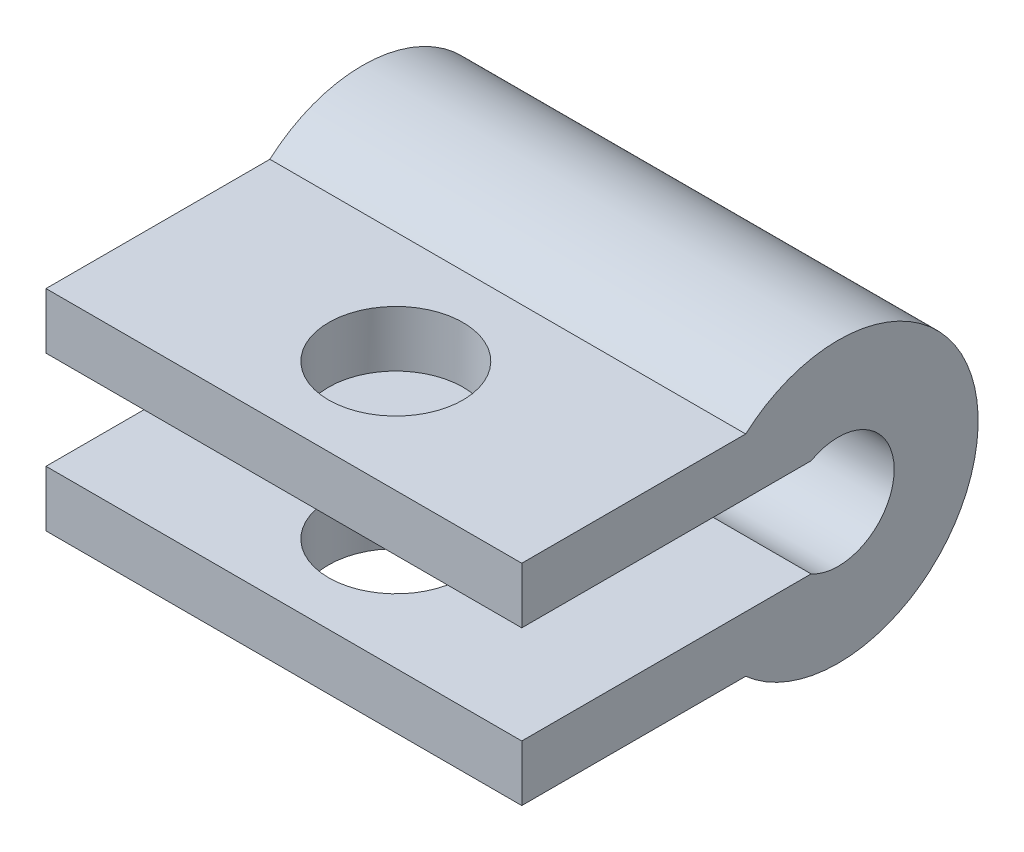
ISO-10303-21;
HEADER;
FILE_DESCRIPTION(('STEP AP214'),'2;1');
FILE_NAME('part.step','',(''),(''),'','','');
FILE_SCHEMA(('AUTOMOTIVE_DESIGN { 1 0 10303 214 1 1 1 1 }'));
ENDSEC;
DATA;
#1=APPLICATION_CONTEXT('core data for automotive mechanical design processes');
#2=APPLICATION_PROTOCOL_DEFINITION('international standard','automotive_design',2000,#1);
#3=PRODUCT_CONTEXT('',#1,'mechanical');
#4=PRODUCT('Part','Part','',(#3));
#5=PRODUCT_RELATED_PRODUCT_CATEGORY('part','',(#4));
#6=PRODUCT_DEFINITION_FORMATION('','',#4);
#7=PRODUCT_DEFINITION_CONTEXT('part definition',#1,'design');
#8=PRODUCT_DEFINITION('design','',#6,#7);
#9=PRODUCT_DEFINITION_SHAPE('','',#8);
#10=(LENGTH_UNIT() NAMED_UNIT(*) SI_UNIT(.MILLI.,.METRE.));
#11=(NAMED_UNIT(*) PLANE_ANGLE_UNIT() SI_UNIT($,.RADIAN.));
#12=(NAMED_UNIT(*) SI_UNIT($,.STERADIAN.) SOLID_ANGLE_UNIT());
#13=UNCERTAINTY_MEASURE_WITH_UNIT(LENGTH_MEASURE(1.E-05),#10,'distance_accuracy_value','');
#14=(GEOMETRIC_REPRESENTATION_CONTEXT(3) GLOBAL_UNCERTAINTY_ASSIGNED_CONTEXT((#13)) GLOBAL_UNIT_ASSIGNED_CONTEXT((#10,
#11,#12)) REPRESENTATION_CONTEXT('',''));
#15=CARTESIAN_POINT('',(0.,0.,0.));
#16=DIRECTION('',(0.,0.,1.));
#17=DIRECTION('',(1.,0.,0.));
#18=AXIS2_PLACEMENT_3D('',#15,#16,#17);
#19=CARTESIAN_POINT('',(-8.5,0.,0.));
#20=DIRECTION('',(1.,0.,0.));
#21=DIRECTION('',(0.,0.,-1.));
#22=AXIS2_PLACEMENT_3D('',#19,#20,#21);
#23=CYLINDRICAL_SURFACE('',#22,2.);
#24=DIRECTION('',(1.,0.,0.));
#25=VECTOR('',#24,1.);
#26=CARTESIAN_POINT('',(-8.5,-1.75,0.968245836551855));
#27=LINE('',#26,#25);
#28=CARTESIAN_POINT('',(-8.5,-1.75,0.968245836551855));
#29=VERTEX_POINT('',#28);
#30=CARTESIAN_POINT('',(8.5,-1.75,0.968245836551855));
#31=VERTEX_POINT('',#30);
#32=EDGE_CURVE('E97',#29,#31,#27,.T.);
#33=ORIENTED_EDGE('',*,*,#32,.T.);
#34=CARTESIAN_POINT('',(8.5,0.,0.));
#35=DIRECTION('',(-1.,0.,0.));
#36=DIRECTION('',(0.,0.,1.));
#37=AXIS2_PLACEMENT_3D('',#34,#35,#36);
#38=CIRCLE('',#37,2.);
#39=CARTESIAN_POINT('',(8.5,1.75,0.968245836551853));
#40=VERTEX_POINT('',#39);
#41=EDGE_CURVE('E100',#40,#31,#38,.T.);
#42=ORIENTED_EDGE('',*,*,#41,.F.);
#43=DIRECTION('',(1.,0.,0.));
#44=VECTOR('',#43,1.);
#45=CARTESIAN_POINT('',(-8.5,1.75,0.968245836551853));
#46=LINE('',#45,#44);
#47=CARTESIAN_POINT('',(-8.5,1.75,0.968245836551853));
#48=VERTEX_POINT('',#47);
#49=EDGE_CURVE('E11',#48,#40,#46,.T.);
#50=ORIENTED_EDGE('',*,*,#49,.F.);
#51=CARTESIAN_POINT('',(-8.5,0.,0.));
#52=DIRECTION('',(-1.,0.,0.));
#53=DIRECTION('',(0.,0.,1.));
#54=AXIS2_PLACEMENT_3D('',#51,#52,#53);
#55=CIRCLE('',#54,2.);
#56=EDGE_CURVE('E101',#48,#29,#55,.T.);
#57=ORIENTED_EDGE('',*,*,#56,.T.);
#58=EDGE_LOOP('',(#33,#42,#50,#57));
#59=FACE_BOUND('',#58,.T.);
#60=ADVANCED_FACE('F35',(#59),#23,.F.);
#61=CARTESIAN_POINT('',(-8.5,1.75,11.3071891388307));
#62=DIRECTION('',(0.,-1.,0.));
#63=DIRECTION('',(0.,0.,-1.));
#64=AXIS2_PLACEMENT_3D('',#61,#62,#63);
#65=PLANE('',#64);
#66=CARTESIAN_POINT('',(0.,1.75,7.30718913883074));
#67=DIRECTION('',(0.,-1.,0.));
#68=DIRECTION('',(0.,0.,-1.));
#69=AXIS2_PLACEMENT_3D('',#66,#67,#68);
#70=CIRCLE('',#69,2.4);
#71=CARTESIAN_POINT('',(0.,1.75,4.90718913883074));
#72=VERTEX_POINT('',#71);
#73=EDGE_CURVE('E119',#72,#72,#70,.T.);
#74=ORIENTED_EDGE('',*,*,#73,.F.);
#75=EDGE_LOOP('',(#74));
#76=FACE_BOUND('',#75,.T.);
#77=ORIENTED_EDGE('',*,*,#49,.T.);
#78=DIRECTION('',(0.,0.,-1.));
#79=VECTOR('',#78,1.);
#80=CARTESIAN_POINT('',(8.5,1.75,11.3071891388307));
#81=LINE('',#80,#79);
#82=CARTESIAN_POINT('',(8.5,1.75,11.3071891388307));
#83=VERTEX_POINT('',#82);
#84=EDGE_CURVE('E118',#83,#40,#81,.T.);
#85=ORIENTED_EDGE('',*,*,#84,.F.);
#86=DIRECTION('',(1.,0.,0.));
#87=VECTOR('',#86,1.);
#88=CARTESIAN_POINT('',(-8.5,1.75,11.3071891388307));
#89=LINE('',#88,#87);
#90=CARTESIAN_POINT('',(-8.5,1.75,11.3071891388307));
#91=VERTEX_POINT('',#90);
#92=EDGE_CURVE('E43',#91,#83,#89,.T.);
#93=ORIENTED_EDGE('',*,*,#92,.F.);
#94=DIRECTION('',(0.,0.,-1.));
#95=VECTOR('',#94,1.);
#96=CARTESIAN_POINT('',(-8.5,1.75,11.3071891388307));
#97=LINE('',#96,#95);
#98=EDGE_CURVE('E106',#91,#48,#97,.T.);
#99=ORIENTED_EDGE('',*,*,#98,.T.);
#100=EDGE_LOOP('',(#77,#85,#93,#99));
#101=FACE_BOUND('',#100,.T.);
#102=ADVANCED_FACE('F188',(#76,#101),#65,.T.);
#103=CARTESIAN_POINT('',(-8.5,3.75,11.3071891388307));
#104=DIRECTION('',(0.,0.,1.));
#105=DIRECTION('',(1.,0.,0.));
#106=AXIS2_PLACEMENT_3D('',#103,#104,#105);
#107=PLANE('',#106);
#108=ORIENTED_EDGE('',*,*,#92,.T.);
#109=DIRECTION('',(0.,-1.,0.));
#110=VECTOR('',#109,1.);
#111=CARTESIAN_POINT('',(8.5,3.75,11.3071891388307));
#112=LINE('',#111,#110);
#113=CARTESIAN_POINT('',(8.5,3.75,11.3071891388307));
#114=VERTEX_POINT('',#113);
#115=EDGE_CURVE('E136',#114,#83,#112,.T.);
#116=ORIENTED_EDGE('',*,*,#115,.F.);
#117=DIRECTION('',(1.,0.,0.));
#118=VECTOR('',#117,1.);
#119=CARTESIAN_POINT('',(-8.5,3.75,11.3071891388307));
#120=LINE('',#119,#118);
#121=CARTESIAN_POINT('',(-8.5,3.75,11.3071891388307));
#122=VERTEX_POINT('',#121);
#123=EDGE_CURVE('E158',#122,#114,#120,.T.);
#124=ORIENTED_EDGE('',*,*,#123,.F.);
#125=DIRECTION('',(0.,-1.,0.));
#126=VECTOR('',#125,1.);
#127=CARTESIAN_POINT('',(-8.5,3.75,11.3071891388307));
#128=LINE('',#127,#126);
#129=EDGE_CURVE('E154',#122,#91,#128,.T.);
#130=ORIENTED_EDGE('',*,*,#129,.T.);
#131=EDGE_LOOP('',(#108,#116,#124,#130));
#132=FACE_BOUND('',#131,.T.);
#133=ADVANCED_FACE('F187',(#132),#107,.T.);
#134=CARTESIAN_POINT('',(-8.5,3.75,3.30718913883074));
#135=DIRECTION('',(0.,1.,0.));
#136=DIRECTION('',(0.,0.,1.));
#137=AXIS2_PLACEMENT_3D('',#134,#135,#136);
#138=PLANE('',#137);
#139=CARTESIAN_POINT('',(0.,3.75,7.30718913883074));
#140=DIRECTION('',(0.,1.,0.));
#141=DIRECTION('',(0.,0.,1.));
#142=AXIS2_PLACEMENT_3D('',#139,#140,#141);
#143=CIRCLE('',#142,2.4);
#144=CARTESIAN_POINT('',(0.,3.75,9.70718913883073));
#145=VERTEX_POINT('',#144);
#146=EDGE_CURVE('E218',#145,#145,#143,.T.);
#147=ORIENTED_EDGE('',*,*,#146,.F.);
#148=EDGE_LOOP('',(#147));
#149=FACE_BOUND('',#148,.T.);
#150=ORIENTED_EDGE('',*,*,#123,.T.);
#151=DIRECTION('',(0.,0.,1.));
#152=VECTOR('',#151,1.);
#153=CARTESIAN_POINT('',(8.5,3.75,3.30718913883074));
#154=LINE('',#153,#152);
#155=CARTESIAN_POINT('',(8.5,3.75,3.30718913883074));
#156=VERTEX_POINT('',#155);
#157=EDGE_CURVE('E133',#156,#114,#154,.T.);
#158=ORIENTED_EDGE('',*,*,#157,.F.);
#159=DIRECTION('',(1.,0.,0.));
#160=VECTOR('',#159,1.);
#161=CARTESIAN_POINT('',(-8.5,3.75,3.30718913883074));
#162=LINE('',#161,#160);
#163=CARTESIAN_POINT('',(-8.5,3.75,3.30718913883074));
#164=VERTEX_POINT('',#163);
#165=EDGE_CURVE('E160',#164,#156,#162,.T.);
#166=ORIENTED_EDGE('',*,*,#165,.F.);
#167=DIRECTION('',(0.,0.,1.));
#168=VECTOR('',#167,1.);
#169=CARTESIAN_POINT('',(-8.5,3.75,3.30718913883074));
#170=LINE('',#169,#168);
#171=EDGE_CURVE('E151',#164,#122,#170,.T.);
#172=ORIENTED_EDGE('',*,*,#171,.T.);
#173=EDGE_LOOP('',(#150,#158,#166,#172));
#174=FACE_BOUND('',#173,.T.);
#175=ADVANCED_FACE('F183',(#149,#174),#138,.T.);
#176=CARTESIAN_POINT('',(-8.5,0.,0.));
#177=DIRECTION('',(1.,0.,0.));
#178=DIRECTION('',(0.,0.,-1.));
#179=AXIS2_PLACEMENT_3D('',#176,#177,#178);
#180=CYLINDRICAL_SURFACE('',#179,5.);
#181=ORIENTED_EDGE('',*,*,#165,.T.);
#182=CARTESIAN_POINT('',(8.5,0.,0.));
#183=DIRECTION('',(1.,0.,0.));
#184=DIRECTION('',(0.,0.,1.));
#185=AXIS2_PLACEMENT_3D('',#182,#183,#184);
#186=CIRCLE('',#185,5.);
#187=CARTESIAN_POINT('',(8.5,-3.75,3.30718913883074));
#188=VERTEX_POINT('',#187);
#189=EDGE_CURVE('E130',#188,#156,#186,.T.);
#190=ORIENTED_EDGE('',*,*,#189,.F.);
#191=DIRECTION('',(1.,0.,0.));
#192=VECTOR('',#191,1.);
#193=CARTESIAN_POINT('',(-8.5,-3.75,3.30718913883074));
#194=LINE('',#193,#192);
#195=CARTESIAN_POINT('',(-8.5,-3.75,3.30718913883074));
#196=VERTEX_POINT('',#195);
#197=EDGE_CURVE('E162',#196,#188,#194,.T.);
#198=ORIENTED_EDGE('',*,*,#197,.F.);
#199=CARTESIAN_POINT('',(-8.5,0.,0.));
#200=DIRECTION('',(1.,0.,0.));
#201=DIRECTION('',(0.,0.,1.));
#202=AXIS2_PLACEMENT_3D('',#199,#200,#201);
#203=CIRCLE('',#202,5.);
#204=EDGE_CURVE('E148',#196,#164,#203,.T.);
#205=ORIENTED_EDGE('',*,*,#204,.T.);
#206=EDGE_LOOP('',(#181,#190,#198,#205));
#207=FACE_BOUND('',#206,.T.);
#208=ADVANCED_FACE('F176',(#207),#180,.T.);
#209=CARTESIAN_POINT('',(-8.5,-3.75,3.30718913883074));
#210=DIRECTION('',(0.,-1.,0.));
#211=DIRECTION('',(0.,0.,-1.));
#212=AXIS2_PLACEMENT_3D('',#209,#210,#211);
#213=PLANE('',#212);
#214=CARTESIAN_POINT('',(0.,-3.75,7.30718913883074));
#215=DIRECTION('',(0.,-1.,0.));
#216=DIRECTION('',(0.,0.,-1.));
#217=AXIS2_PLACEMENT_3D('',#214,#215,#216);
#218=CIRCLE('',#217,2.4);
#219=CARTESIAN_POINT('',(0.,-3.75,4.90718913883074));
#220=VERTEX_POINT('',#219);
#221=EDGE_CURVE('E122',#220,#220,#218,.T.);
#222=ORIENTED_EDGE('',*,*,#221,.F.);
#223=EDGE_LOOP('',(#222));
#224=FACE_BOUND('',#223,.T.);
#225=ORIENTED_EDGE('',*,*,#197,.T.);
#226=DIRECTION('',(0.,0.,-1.));
#227=VECTOR('',#226,1.);
#228=CARTESIAN_POINT('',(8.5,-3.75,3.30718913883074));
#229=LINE('',#228,#227);
#230=CARTESIAN_POINT('',(8.5,-3.75,11.3071891388307));
#231=VERTEX_POINT('',#230);
#232=EDGE_CURVE('E127',#231,#188,#229,.T.);
#233=ORIENTED_EDGE('',*,*,#232,.F.);
#234=DIRECTION('',(1.,0.,0.));
#235=VECTOR('',#234,1.);
#236=CARTESIAN_POINT('',(-8.5,-3.75,11.3071891388307));
#237=LINE('',#236,#235);
#238=CARTESIAN_POINT('',(-8.5,-3.75,11.3071891388307));
#239=VERTEX_POINT('',#238);
#240=EDGE_CURVE('E164',#239,#231,#237,.T.);
#241=ORIENTED_EDGE('',*,*,#240,.F.);
#242=DIRECTION('',(0.,0.,-1.));
#243=VECTOR('',#242,1.);
#244=CARTESIAN_POINT('',(-8.5,-3.75,3.30718913883074));
#245=LINE('',#244,#243);
#246=EDGE_CURVE('E145',#239,#196,#245,.T.);
#247=ORIENTED_EDGE('',*,*,#246,.T.);
#248=EDGE_LOOP('',(#225,#233,#241,#247));
#249=FACE_BOUND('',#248,.T.);
#250=ADVANCED_FACE('F173',(#224,#249),#213,.T.);
#251=CARTESIAN_POINT('',(-8.5,-3.75,11.3071891388307));
#252=DIRECTION('',(0.,0.,1.));
#253=DIRECTION('',(1.,0.,0.));
#254=AXIS2_PLACEMENT_3D('',#251,#252,#253);
#255=PLANE('',#254);
#256=ORIENTED_EDGE('',*,*,#240,.T.);
#257=DIRECTION('',(0.,-1.,0.));
#258=VECTOR('',#257,1.);
#259=CARTESIAN_POINT('',(8.5,-3.75,11.3071891388307));
#260=LINE('',#259,#258);
#261=CARTESIAN_POINT('',(8.5,-1.75,11.3071891388307));
#262=VERTEX_POINT('',#261);
#263=EDGE_CURVE('E113',#262,#231,#260,.T.);
#264=ORIENTED_EDGE('',*,*,#263,.F.);
#265=DIRECTION('',(1.,0.,0.));
#266=VECTOR('',#265,1.);
#267=CARTESIAN_POINT('',(-8.5,-1.75,11.3071891388307));
#268=LINE('',#267,#266);
#269=CARTESIAN_POINT('',(-8.5,-1.75,11.3071891388307));
#270=VERTEX_POINT('',#269);
#271=EDGE_CURVE('E105',#270,#262,#268,.T.);
#272=ORIENTED_EDGE('',*,*,#271,.F.);
#273=DIRECTION('',(0.,-1.,0.));
#274=VECTOR('',#273,1.);
#275=CARTESIAN_POINT('',(-8.5,-3.75,11.3071891388307));
#276=LINE('',#275,#274);
#277=EDGE_CURVE('E142',#270,#239,#276,.T.);
#278=ORIENTED_EDGE('',*,*,#277,.T.);
#279=EDGE_LOOP('',(#256,#264,#272,#278));
#280=FACE_BOUND('',#279,.T.);
#281=ADVANCED_FACE('F167',(#280),#255,.T.);
#282=CARTESIAN_POINT('',(-8.5,-1.75,11.3071891388307));
#283=DIRECTION('',(0.,1.,0.));
#284=DIRECTION('',(0.,0.,1.));
#285=AXIS2_PLACEMENT_3D('',#282,#283,#284);
#286=PLANE('',#285);
#287=CARTESIAN_POINT('',(0.,-1.75,7.30718913883074));
#288=DIRECTION('',(0.,1.,0.));
#289=DIRECTION('',(0.,0.,1.));
#290=AXIS2_PLACEMENT_3D('',#287,#288,#289);
#291=CIRCLE('',#290,2.4);
#292=CARTESIAN_POINT('',(0.,-1.75,9.70718913883073));
#293=VERTEX_POINT('',#292);
#294=EDGE_CURVE('E38',#293,#293,#291,.T.);
#295=ORIENTED_EDGE('',*,*,#294,.F.);
#296=EDGE_LOOP('',(#295));
#297=FACE_BOUND('',#296,.T.);
#298=ORIENTED_EDGE('',*,*,#271,.T.);
#299=DIRECTION('',(0.,0.,1.));
#300=VECTOR('',#299,1.);
#301=CARTESIAN_POINT('',(8.5,-1.75,11.3071891388307));
#302=LINE('',#301,#300);
#303=EDGE_CURVE('E108',#31,#262,#302,.T.);
#304=ORIENTED_EDGE('',*,*,#303,.F.);
#305=ORIENTED_EDGE('',*,*,#32,.F.);
#306=DIRECTION('',(0.,0.,1.));
#307=VECTOR('',#306,1.);
#308=CARTESIAN_POINT('',(-8.5,-1.75,11.3071891388307));
#309=LINE('',#308,#307);
#310=EDGE_CURVE('E140',#29,#270,#309,.T.);
#311=ORIENTED_EDGE('',*,*,#310,.T.);
#312=EDGE_LOOP('',(#298,#304,#305,#311));
#313=FACE_BOUND('',#312,.T.);
#314=ADVANCED_FACE('F109',(#297,#313),#286,.T.);
#315=CARTESIAN_POINT('',(-8.5,0.,0.));
#316=DIRECTION('',(-1.,0.,0.));
#317=DIRECTION('',(0.,0.,1.));
#318=AXIS2_PLACEMENT_3D('',#315,#316,#317);
#319=PLANE('',#318);
#320=ORIENTED_EDGE('',*,*,#56,.F.);
#321=ORIENTED_EDGE('',*,*,#98,.F.);
#322=ORIENTED_EDGE('',*,*,#129,.F.);
#323=ORIENTED_EDGE('',*,*,#171,.F.);
#324=ORIENTED_EDGE('',*,*,#204,.F.);
#325=ORIENTED_EDGE('',*,*,#246,.F.);
#326=ORIENTED_EDGE('',*,*,#277,.F.);
#327=ORIENTED_EDGE('',*,*,#310,.F.);
#328=EDGE_LOOP('',(#320,#321,#322,#323,#324,#325,#326,#327));
#329=FACE_BOUND('',#328,.T.);
#330=ADVANCED_FACE('F179',(#329),#319,.T.);
#331=CARTESIAN_POINT('',(8.5,0.,0.));
#332=DIRECTION('',(-1.,0.,0.));
#333=DIRECTION('',(0.,0.,1.));
#334=AXIS2_PLACEMENT_3D('',#331,#332,#333);
#335=PLANE('',#334);
#336=ORIENTED_EDGE('',*,*,#41,.T.);
#337=ORIENTED_EDGE('',*,*,#303,.T.);
#338=ORIENTED_EDGE('',*,*,#263,.T.);
#339=ORIENTED_EDGE('',*,*,#232,.T.);
#340=ORIENTED_EDGE('',*,*,#189,.T.);
#341=ORIENTED_EDGE('',*,*,#157,.T.);
#342=ORIENTED_EDGE('',*,*,#115,.T.);
#343=ORIENTED_EDGE('',*,*,#84,.T.);
#344=EDGE_LOOP('',(#336,#337,#338,#339,#340,#341,#342,#343));
#345=FACE_BOUND('',#344,.T.);
#346=ADVANCED_FACE('F116',(#345),#335,.F.);
#347=CARTESIAN_POINT('',(0.,3.75,7.30718913883074));
#348=DIRECTION('',(0.,1.,0.));
#349=DIRECTION('',(0.,0.,1.));
#350=AXIS2_PLACEMENT_3D('',#347,#348,#349);
#351=CYLINDRICAL_SURFACE('',#350,2.4);
#352=ORIENTED_EDGE('',*,*,#221,.T.);
#353=EDGE_LOOP('',(#352));
#354=FACE_BOUND('',#353,.T.);
#355=ORIENTED_EDGE('',*,*,#294,.T.);
#356=EDGE_LOOP('',(#355));
#357=FACE_BOUND('',#356,.T.);
#358=ADVANCED_FACE('F226',(#354,#357),#351,.F.);
#359=ORIENTED_EDGE('',*,*,#73,.T.);
#360=EDGE_LOOP('',(#359));
#361=FACE_BOUND('',#360,.T.);
#362=ORIENTED_EDGE('',*,*,#146,.T.);
#363=EDGE_LOOP('',(#362));
#364=FACE_BOUND('',#363,.T.);
#365=ADVANCED_FACE('F224',(#361,#364),#351,.F.);
#366=CLOSED_SHELL('',(#60,#102,#133,#175,#208,#250,#281,#314,#330,#346,#358,#365));
#367=MANIFOLD_SOLID_BREP('B2',#366);
#368=ADVANCED_BREP_SHAPE_REPRESENTATION('',(#18,#367),#14);
#369=SHAPE_DEFINITION_REPRESENTATION(#9,#368);
ENDSEC;
END-ISO-10303-21;
